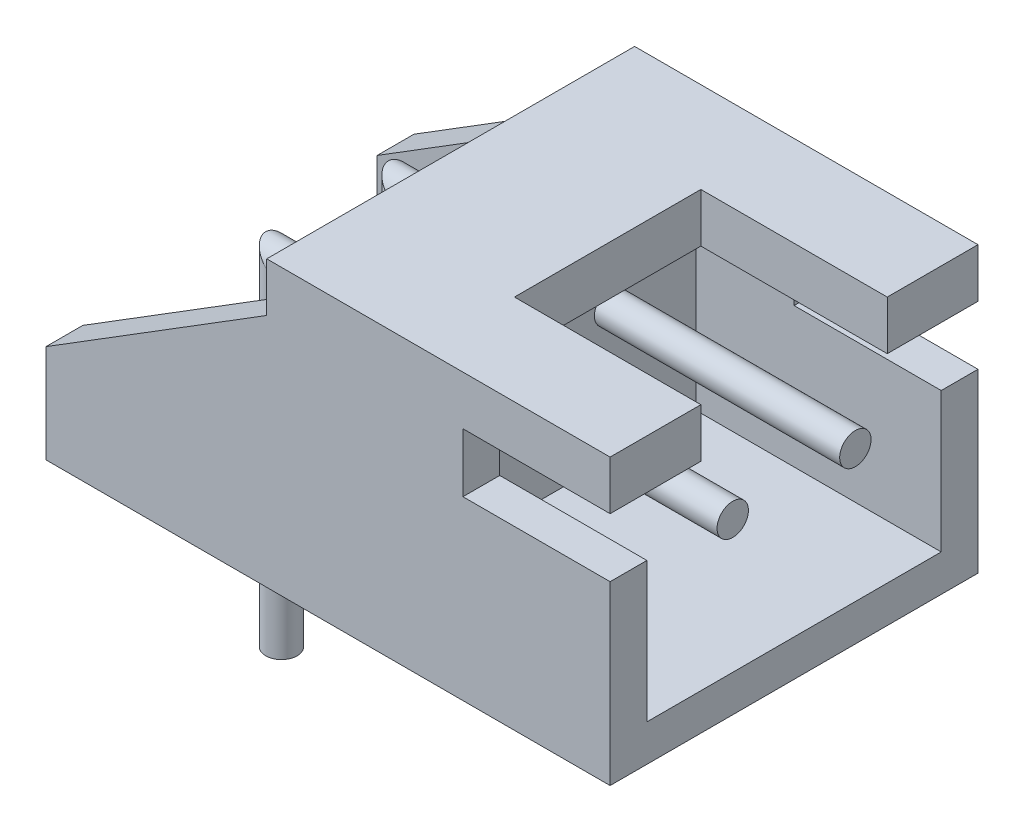
ISO-10303-21;
HEADER;
FILE_DESCRIPTION(('STEP AP214'),'2;1');
FILE_NAME('part.step','',(''),(''),'','','');
FILE_SCHEMA(('AUTOMOTIVE_DESIGN { 1 0 10303 214 1 1 1 1 }'));
ENDSEC;
DATA;
#1=APPLICATION_CONTEXT('core data for automotive mechanical design processes');
#2=APPLICATION_PROTOCOL_DEFINITION('international standard','automotive_design',2000,#1);
#3=PRODUCT_CONTEXT('',#1,'mechanical');
#4=PRODUCT('Part','Part','',(#3));
#5=PRODUCT_RELATED_PRODUCT_CATEGORY('part','',(#4));
#6=PRODUCT_DEFINITION_FORMATION('','',#4);
#7=PRODUCT_DEFINITION_CONTEXT('part definition',#1,'design');
#8=PRODUCT_DEFINITION('design','',#6,#7);
#9=PRODUCT_DEFINITION_SHAPE('','',#8);
#10=(LENGTH_UNIT() NAMED_UNIT(*) SI_UNIT(.MILLI.,.METRE.));
#11=(NAMED_UNIT(*) PLANE_ANGLE_UNIT() SI_UNIT($,.RADIAN.));
#12=(NAMED_UNIT(*) SI_UNIT($,.STERADIAN.) SOLID_ANGLE_UNIT());
#13=UNCERTAINTY_MEASURE_WITH_UNIT(LENGTH_MEASURE(1.E-05),#10,'distance_accuracy_value','');
#14=(GEOMETRIC_REPRESENTATION_CONTEXT(3) GLOBAL_UNCERTAINTY_ASSIGNED_CONTEXT((#13)) GLOBAL_UNIT_ASSIGNED_CONTEXT((#10,
#11,#12)) REPRESENTATION_CONTEXT('',''));
#15=CARTESIAN_POINT('',(0.,0.,0.));
#16=DIRECTION('',(0.,0.,1.));
#17=DIRECTION('',(1.,0.,0.));
#18=AXIS2_PLACEMENT_3D('',#15,#16,#17);
#19=CARTESIAN_POINT('',(11.5,3.45,5.));
#20=DIRECTION('',(-1.,0.,0.));
#21=DIRECTION('',(0.,0.,1.));
#22=AXIS2_PLACEMENT_3D('',#19,#20,#21);
#23=PLANE('',#22);
#24=CARTESIAN_POINT('',(11.5,3.45,5.));
#25=DIRECTION('',(-1.,0.,0.));
#26=DIRECTION('',(0.,0.,1.));
#27=AXIS2_PLACEMENT_3D('',#24,#25,#26);
#28=CIRCLE('',#27,0.32);
#29=CARTESIAN_POINT('',(11.5,3.45,5.32));
#30=VERTEX_POINT('',#29);
#31=EDGE_CURVE('E20',#30,#30,#28,.T.);
#32=ORIENTED_EDGE('',*,*,#31,.F.);
#33=EDGE_LOOP('',(#32));
#34=FACE_BOUND('',#33,.T.);
#35=ADVANCED_FACE('F17',(#34),#23,.F.);
#36=CARTESIAN_POINT('',(11.5,3.45,2.5));
#37=DIRECTION('',(1.,0.,0.));
#38=DIRECTION('',(0.,0.,-1.));
#39=AXIS2_PLACEMENT_3D('',#36,#37,#38);
#40=PLANE('',#39);
#41=CARTESIAN_POINT('',(11.5,3.45,2.5));
#42=DIRECTION('',(1.,0.,0.));
#43=DIRECTION('',(0.,0.,-1.));
#44=AXIS2_PLACEMENT_3D('',#41,#42,#43);
#45=CIRCLE('',#44,0.32);
#46=CARTESIAN_POINT('',(11.5,3.45,2.18));
#47=VERTEX_POINT('',#46);
#48=EDGE_CURVE('E258',#47,#47,#45,.F.);
#49=ORIENTED_EDGE('',*,*,#48,.F.);
#50=EDGE_LOOP('',(#49));
#51=FACE_BOUND('',#50,.T.);
#52=ADVANCED_FACE('F269',(#51),#40,.T.);
#53=CARTESIAN_POINT('',(2.3,-3.4,2.5));
#54=DIRECTION('',(0.,1.,0.));
#55=DIRECTION('',(0.,0.,1.));
#56=AXIS2_PLACEMENT_3D('',#53,#54,#55);
#57=PLANE('',#56);
#58=CARTESIAN_POINT('',(2.3,-3.4,2.5));
#59=DIRECTION('',(0.,1.,0.));
#60=DIRECTION('',(0.,0.,1.));
#61=AXIS2_PLACEMENT_3D('',#58,#59,#60);
#62=CIRCLE('',#61,0.32);
#63=CARTESIAN_POINT('',(2.3,-3.4,2.82));
#64=VERTEX_POINT('',#63);
#65=EDGE_CURVE('E256',#64,#64,#62,.T.);
#66=ORIENTED_EDGE('',*,*,#65,.F.);
#67=EDGE_LOOP('',(#66));
#68=FACE_BOUND('',#67,.T.);
#69=ADVANCED_FACE('F274',(#68),#57,.F.);
#70=CARTESIAN_POINT('',(11.5,3.45,5.));
#71=DIRECTION('',(-1.,0.,0.));
#72=DIRECTION('',(0.,0.,1.));
#73=AXIS2_PLACEMENT_3D('',#70,#71,#72);
#74=CYLINDRICAL_SURFACE('',#73,0.32);
#75=ORIENTED_EDGE('',*,*,#31,.T.);
#76=EDGE_LOOP('',(#75));
#77=FACE_BOUND('',#76,.T.);
#78=CARTESIAN_POINT('',(6.5,3.45,5.));
#79=DIRECTION('',(-1.,0.,0.));
#80=DIRECTION('',(0.,0.,1.));
#81=AXIS2_PLACEMENT_3D('',#78,#79,#80);
#82=CIRCLE('',#81,0.32);
#83=CARTESIAN_POINT('',(6.5,3.45,5.32));
#84=VERTEX_POINT('',#83);
#85=EDGE_CURVE('E253',#84,#84,#82,.T.);
#86=ORIENTED_EDGE('',*,*,#85,.F.);
#87=EDGE_LOOP('',(#86));
#88=FACE_BOUND('',#87,.T.);
#89=ADVANCED_FACE('F265',(#77,#88),#74,.T.);
#90=CARTESIAN_POINT('',(11.5,3.45,2.5));
#91=DIRECTION('',(1.,0.,0.));
#92=DIRECTION('',(0.,0.,-1.));
#93=AXIS2_PLACEMENT_3D('',#90,#91,#92);
#94=CYLINDRICAL_SURFACE('',#93,0.32);
#95=ORIENTED_EDGE('',*,*,#48,.T.);
#96=EDGE_LOOP('',(#95));
#97=FACE_BOUND('',#96,.T.);
#98=CARTESIAN_POINT('',(6.5,3.45,2.5));
#99=DIRECTION('',(1.,0.,0.));
#100=DIRECTION('',(0.,0.,-1.));
#101=AXIS2_PLACEMENT_3D('',#98,#99,#100);
#102=CIRCLE('',#101,0.32);
#103=CARTESIAN_POINT('',(6.5,3.45,2.18));
#104=VERTEX_POINT('',#103);
#105=EDGE_CURVE('E234',#104,#104,#102,.F.);
#106=ORIENTED_EDGE('',*,*,#105,.F.);
#107=EDGE_LOOP('',(#106));
#108=FACE_BOUND('',#107,.T.);
#109=ADVANCED_FACE('F396',(#97,#108),#94,.T.);
#110=CARTESIAN_POINT('',(2.3,-3.4,5.));
#111=DIRECTION('',(0.,-1.,0.));
#112=DIRECTION('',(0.,0.,-1.));
#113=AXIS2_PLACEMENT_3D('',#110,#111,#112);
#114=PLANE('',#113);
#115=CARTESIAN_POINT('',(2.3,-3.4,5.));
#116=DIRECTION('',(0.,-1.,0.));
#117=DIRECTION('',(0.,0.,-1.));
#118=AXIS2_PLACEMENT_3D('',#115,#116,#117);
#119=CIRCLE('',#118,0.32);
#120=CARTESIAN_POINT('',(2.3,-3.4,4.68));
#121=VERTEX_POINT('',#120);
#122=EDGE_CURVE('E223',#121,#121,#119,.F.);
#123=ORIENTED_EDGE('',*,*,#122,.F.);
#124=EDGE_LOOP('',(#123));
#125=FACE_BOUND('',#124,.T.);
#126=ADVANCED_FACE('F392',(#125),#114,.T.);
#127=CARTESIAN_POINT('',(2.3,3.45,2.5));
#128=DIRECTION('',(0.,1.,0.));
#129=DIRECTION('',(0.,0.,1.));
#130=AXIS2_PLACEMENT_3D('',#127,#128,#129);
#131=CYLINDRICAL_SURFACE('',#130,0.32);
#132=ORIENTED_EDGE('',*,*,#65,.T.);
#133=EDGE_LOOP('',(#132));
#134=FACE_BOUND('',#133,.T.);
#135=CARTESIAN_POINT('',(2.3,3.45,2.5));
#136=DIRECTION('',(0.707106781186547,0.707106781186547,0.));
#137=DIRECTION('',(-0.707106781186547,0.707106781186547,0.));
#138=AXIS2_PLACEMENT_3D('',#135,#136,#137);
#139=ELLIPSE('',#138,0.45254833995939,0.32);
#140=CARTESIAN_POINT('',(1.98,3.77,2.5));
#141=VERTEX_POINT('',#140);
#142=EDGE_CURVE('E220',#141,#141,#139,.T.);
#143=ORIENTED_EDGE('',*,*,#142,.F.);
#144=EDGE_LOOP('',(#143));
#145=FACE_BOUND('',#144,.T.);
#146=ADVANCED_FACE('F388',(#134,#145),#131,.T.);
#147=CARTESIAN_POINT('',(6.5,0.,0.));
#148=DIRECTION('',(1.,0.,0.));
#149=DIRECTION('',(0.,0.,-1.));
#150=AXIS2_PLACEMENT_3D('',#147,#148,#149);
#151=PLANE('',#150);
#152=ORIENTED_EDGE('',*,*,#105,.T.);
#153=EDGE_LOOP('',(#152));
#154=FACE_BOUND('',#153,.T.);
#155=ORIENTED_EDGE('',*,*,#85,.T.);
#156=EDGE_LOOP('',(#155));
#157=FACE_BOUND('',#156,.T.);
#158=DIRECTION('',(0.,0.,-1.));
#159=VECTOR('',#158,1.);
#160=CARTESIAN_POINT('',(6.5,4.8,0.));
#161=LINE('',#160,#159);
#162=CARTESIAN_POINT('',(6.5,4.8,6.75));
#163=VERTEX_POINT('',#162);
#164=CARTESIAN_POINT('',(6.5,4.8,0.75));
#165=VERTEX_POINT('',#164);
#166=EDGE_CURVE('E522',#163,#165,#161,.T.);
#167=ORIENTED_EDGE('',*,*,#166,.F.);
#168=DIRECTION('',(0.,1.,0.));
#169=VECTOR('',#168,1.);
#170=CARTESIAN_POINT('',(6.5,4.8,6.75));
#171=LINE('',#170,#169);
#172=CARTESIAN_POINT('',(6.5,0.75,6.75));
#173=VERTEX_POINT('',#172);
#174=EDGE_CURVE('E543',#163,#173,#171,.F.);
#175=ORIENTED_EDGE('',*,*,#174,.T.);
#176=DIRECTION('',(0.,0.,-1.));
#177=VECTOR('',#176,1.);
#178=CARTESIAN_POINT('',(6.5,0.75,6.75));
#179=LINE('',#178,#177);
#180=CARTESIAN_POINT('',(6.5,0.75,0.75));
#181=VERTEX_POINT('',#180);
#182=EDGE_CURVE('E175',#173,#181,#179,.T.);
#183=ORIENTED_EDGE('',*,*,#182,.T.);
#184=DIRECTION('',(0.,1.,0.));
#185=VECTOR('',#184,1.);
#186=CARTESIAN_POINT('',(6.5,0.75,0.75));
#187=LINE('',#186,#185);
#188=EDGE_CURVE('E191',#181,#165,#187,.T.);
#189=ORIENTED_EDGE('',*,*,#188,.T.);
#190=EDGE_LOOP('',(#167,#175,#183,#189));
#191=FACE_BOUND('',#190,.T.);
#192=ADVANCED_FACE('F384',(#154,#157,#191),#151,.T.);
#193=CARTESIAN_POINT('',(7.7,5.8,1.85));
#194=DIRECTION('',(-1.,0.,0.));
#195=DIRECTION('',(0.,0.,1.));
#196=AXIS2_PLACEMENT_3D('',#193,#194,#195);
#197=PLANE('',#196);
#198=DIRECTION('',(0.,0.,-1.));
#199=VECTOR('',#198,1.);
#200=CARTESIAN_POINT('',(7.7,4.8,0.));
#201=LINE('',#200,#199);
#202=CARTESIAN_POINT('',(7.7,4.8,1.85));
#203=VERTEX_POINT('',#202);
#204=CARTESIAN_POINT('',(7.7,4.8,5.65));
#205=VERTEX_POINT('',#204);
#206=EDGE_CURVE('E510',#203,#205,#201,.F.);
#207=ORIENTED_EDGE('',*,*,#206,.F.);
#208=DIRECTION('',(0.,1.,0.));
#209=VECTOR('',#208,1.);
#210=CARTESIAN_POINT('',(7.7,5.8,1.85));
#211=LINE('',#210,#209);
#212=CARTESIAN_POINT('',(7.7,5.8,1.85));
#213=VERTEX_POINT('',#212);
#214=EDGE_CURVE('E232',#203,#213,#211,.T.);
#215=ORIENTED_EDGE('',*,*,#214,.T.);
#216=DIRECTION('',(0.,0.,1.));
#217=VECTOR('',#216,1.);
#218=CARTESIAN_POINT('',(7.7,5.8,0.));
#219=LINE('',#218,#217);
#220=CARTESIAN_POINT('',(7.7,5.8,5.65));
#221=VERTEX_POINT('',#220);
#222=EDGE_CURVE('E499',#221,#213,#219,.F.);
#223=ORIENTED_EDGE('',*,*,#222,.F.);
#224=DIRECTION('',(0.,1.,0.));
#225=VECTOR('',#224,1.);
#226=CARTESIAN_POINT('',(7.7,5.8,5.65));
#227=LINE('',#226,#225);
#228=EDGE_CURVE('E221',#221,#205,#227,.F.);
#229=ORIENTED_EDGE('',*,*,#228,.T.);
#230=EDGE_LOOP('',(#207,#215,#223,#229));
#231=FACE_BOUND('',#230,.T.);
#232=ADVANCED_FACE('F380',(#231),#197,.F.);
#233=CARTESIAN_POINT('',(11.61432917264,5.8,1.85));
#234=DIRECTION('',(0.,0.,-1.));
#235=DIRECTION('',(-1.,0.,0.));
#236=AXIS2_PLACEMENT_3D('',#233,#234,#235);
#237=PLANE('',#236);
#238=ORIENTED_EDGE('',*,*,#214,.F.);
#239=DIRECTION('',(1.,0.,0.));
#240=VECTOR('',#239,1.);
#241=CARTESIAN_POINT('',(8.5,4.8,1.85));
#242=LINE('',#241,#240);
#243=CARTESIAN_POINT('',(11.5,4.8,1.85));
#244=VERTEX_POINT('',#243);
#245=EDGE_CURVE('E513',#244,#203,#242,.F.);
#246=ORIENTED_EDGE('',*,*,#245,.F.);
#247=DIRECTION('',(0.,1.,0.));
#248=VECTOR('',#247,1.);
#249=CARTESIAN_POINT('',(11.5,4.8,1.85));
#250=LINE('',#249,#248);
#251=CARTESIAN_POINT('',(11.5,5.8,1.85));
#252=VERTEX_POINT('',#251);
#253=EDGE_CURVE('E228',#252,#244,#250,.F.);
#254=ORIENTED_EDGE('',*,*,#253,.F.);
#255=DIRECTION('',(1.,0.,0.));
#256=VECTOR('',#255,1.);
#257=CARTESIAN_POINT('',(11.5,5.8,1.85));
#258=LINE('',#257,#256);
#259=EDGE_CURVE('E496',#213,#252,#258,.T.);
#260=ORIENTED_EDGE('',*,*,#259,.F.);
#261=EDGE_LOOP('',(#238,#246,#254,#260));
#262=FACE_BOUND('',#261,.T.);
#263=ADVANCED_FACE('F376',(#262),#237,.F.);
#264=CARTESIAN_POINT('',(11.5,4.8,0.));
#265=DIRECTION('',(1.,0.,0.));
#266=DIRECTION('',(0.,0.,-1.));
#267=AXIS2_PLACEMENT_3D('',#264,#265,#266);
#268=PLANE('',#267);
#269=DIRECTION('',(0.,0.,1.));
#270=VECTOR('',#269,1.);
#271=CARTESIAN_POINT('',(11.5,5.8,0.));
#272=LINE('',#271,#270);
#273=CARTESIAN_POINT('',(11.5,5.8,0.));
#274=VERTEX_POINT('',#273);
#275=EDGE_CURVE('E493',#252,#274,#272,.F.);
#276=ORIENTED_EDGE('',*,*,#275,.F.);
#277=ORIENTED_EDGE('',*,*,#253,.T.);
#278=DIRECTION('',(0.,0.,-1.));
#279=VECTOR('',#278,1.);
#280=CARTESIAN_POINT('',(11.5,4.8,0.));
#281=LINE('',#280,#279);
#282=CARTESIAN_POINT('',(11.5,4.8,0.));
#283=VERTEX_POINT('',#282);
#284=EDGE_CURVE('E516',#283,#244,#281,.F.);
#285=ORIENTED_EDGE('',*,*,#284,.F.);
#286=DIRECTION('',(0.,1.,0.));
#287=VECTOR('',#286,1.);
#288=CARTESIAN_POINT('',(11.5,4.8,0.));
#289=LINE('',#288,#287);
#290=EDGE_CURVE('E230',#283,#274,#289,.T.);
#291=ORIENTED_EDGE('',*,*,#290,.T.);
#292=EDGE_LOOP('',(#276,#277,#285,#291));
#293=FACE_BOUND('',#292,.T.);
#294=ADVANCED_FACE('F372',(#293),#268,.T.);
#295=CARTESIAN_POINT('',(11.5,4.8,0.));
#296=DIRECTION('',(1.,0.,0.));
#297=DIRECTION('',(0.,0.,-1.));
#298=AXIS2_PLACEMENT_3D('',#295,#296,#297);
#299=PLANE('',#298);
#300=DIRECTION('',(0.,0.,-1.));
#301=VECTOR('',#300,1.);
#302=CARTESIAN_POINT('',(11.5,4.8,0.));
#303=LINE('',#302,#301);
#304=CARTESIAN_POINT('',(11.5,4.8,5.65));
#305=VERTEX_POINT('',#304);
#306=CARTESIAN_POINT('',(11.5,4.8,7.5));
#307=VERTEX_POINT('',#306);
#308=EDGE_CURVE('E531',#305,#307,#303,.F.);
#309=ORIENTED_EDGE('',*,*,#308,.F.);
#310=DIRECTION('',(0.,1.,0.));
#311=VECTOR('',#310,1.);
#312=CARTESIAN_POINT('',(11.5,5.8,5.65));
#313=LINE('',#312,#311);
#314=CARTESIAN_POINT('',(11.5,5.8,5.65));
#315=VERTEX_POINT('',#314);
#316=EDGE_CURVE('E224',#305,#315,#313,.T.);
#317=ORIENTED_EDGE('',*,*,#316,.T.);
#318=DIRECTION('',(0.,0.,1.));
#319=VECTOR('',#318,1.);
#320=CARTESIAN_POINT('',(11.5,5.8,0.));
#321=LINE('',#320,#319);
#322=CARTESIAN_POINT('',(11.5,5.8,7.5));
#323=VERTEX_POINT('',#322);
#324=EDGE_CURVE('E490',#323,#315,#321,.F.);
#325=ORIENTED_EDGE('',*,*,#324,.F.);
#326=DIRECTION('',(0.,1.,0.));
#327=VECTOR('',#326,1.);
#328=CARTESIAN_POINT('',(11.5,4.8,7.5));
#329=LINE('',#328,#327);
#330=EDGE_CURVE('E226',#323,#307,#329,.F.);
#331=ORIENTED_EDGE('',*,*,#330,.T.);
#332=EDGE_LOOP('',(#309,#317,#325,#331));
#333=FACE_BOUND('',#332,.T.);
#334=ADVANCED_FACE('F368',(#333),#299,.T.);
#335=CARTESIAN_POINT('',(7.7,5.8,5.65));
#336=DIRECTION('',(0.,0.,1.));
#337=DIRECTION('',(1.,0.,0.));
#338=AXIS2_PLACEMENT_3D('',#335,#336,#337);
#339=PLANE('',#338);
#340=ORIENTED_EDGE('',*,*,#228,.F.);
#341=DIRECTION('',(1.,0.,0.));
#342=VECTOR('',#341,1.);
#343=CARTESIAN_POINT('',(11.5,5.8,5.65));
#344=LINE('',#343,#342);
#345=EDGE_CURVE('E246',#315,#221,#344,.F.);
#346=ORIENTED_EDGE('',*,*,#345,.F.);
#347=ORIENTED_EDGE('',*,*,#316,.F.);
#348=DIRECTION('',(1.,0.,0.));
#349=VECTOR('',#348,1.);
#350=CARTESIAN_POINT('',(8.5,4.8,5.65));
#351=LINE('',#350,#349);
#352=EDGE_CURVE('E507',#205,#305,#351,.T.);
#353=ORIENTED_EDGE('',*,*,#352,.F.);
#354=EDGE_LOOP('',(#340,#346,#347,#353));
#355=FACE_BOUND('',#354,.T.);
#356=ADVANCED_FACE('F364',(#355),#339,.F.);
#357=CARTESIAN_POINT('',(2.3,3.45,5.));
#358=DIRECTION('',(0.,-1.,0.));
#359=DIRECTION('',(0.,0.,-1.));
#360=AXIS2_PLACEMENT_3D('',#357,#358,#359);
#361=CYLINDRICAL_SURFACE('',#360,0.32);
#362=ORIENTED_EDGE('',*,*,#122,.T.);
#363=EDGE_LOOP('',(#362));
#364=FACE_BOUND('',#363,.T.);
#365=CARTESIAN_POINT('',(2.3,3.45,5.));
#366=DIRECTION('',(-0.707106781186547,-0.707106781186547,0.));
#367=DIRECTION('',(0.707106781186547,-0.707106781186547,0.));
#368=AXIS2_PLACEMENT_3D('',#365,#366,#367);
#369=ELLIPSE('',#368,0.45254833995939,0.32);
#370=CARTESIAN_POINT('',(2.62,3.13,5.));
#371=VERTEX_POINT('',#370);
#372=EDGE_CURVE('E242',#371,#371,#369,.F.);
#373=ORIENTED_EDGE('',*,*,#372,.F.);
#374=EDGE_LOOP('',(#373));
#375=FACE_BOUND('',#374,.T.);
#376=ADVANCED_FACE('F360',(#364,#375),#361,.T.);
#377=CARTESIAN_POINT('',(4.5,4.8,0.));
#378=DIRECTION('',(-0.52830188679248,0.849056603773568,0.));
#379=DIRECTION('',(-0.849056603773568,-0.52830188679248,0.));
#380=AXIS2_PLACEMENT_3D('',#377,#378,#379);
#381=PLANE('',#380);
#382=DIRECTION('',(0.,0.,1.));
#383=VECTOR('',#382,1.);
#384=CARTESIAN_POINT('',(0.,2.,0.));
#385=LINE('',#384,#383);
#386=CARTESIAN_POINT('',(0.,1.99999999999996,0.75));
#387=VERTEX_POINT('',#386);
#388=CARTESIAN_POINT('',(0.,1.99999999999993,0.));
#389=VERTEX_POINT('',#388);
#390=EDGE_CURVE('E215',#387,#389,#385,.F.);
#391=ORIENTED_EDGE('',*,*,#390,.F.);
#392=DIRECTION('',(0.849056603773585,0.528301886792453,0.));
#393=VECTOR('',#392,1.);
#394=CARTESIAN_POINT('',(0.,2.,0.75));
#395=LINE('',#394,#393);
#396=CARTESIAN_POINT('',(4.5,4.8,0.75));
#397=VERTEX_POINT('',#396);
#398=EDGE_CURVE('E483',#387,#397,#395,.T.);
#399=ORIENTED_EDGE('',*,*,#398,.T.);
#400=DIRECTION('',(0.,0.,1.));
#401=VECTOR('',#400,1.);
#402=CARTESIAN_POINT('',(4.5,4.8,0.));
#403=LINE('',#402,#401);
#404=CARTESIAN_POINT('',(4.5,4.8,0.));
#405=VERTEX_POINT('',#404);
#406=EDGE_CURVE('E218',#397,#405,#403,.F.);
#407=ORIENTED_EDGE('',*,*,#406,.T.);
#408=DIRECTION('',(-0.849056603773585,-0.528301886792453,0.));
#409=VECTOR('',#408,1.);
#410=CARTESIAN_POINT('',(4.5,4.8,0.));
#411=LINE('',#410,#409);
#412=EDGE_CURVE('E481',#405,#389,#411,.T.);
#413=ORIENTED_EDGE('',*,*,#412,.T.);
#414=EDGE_LOOP('',(#391,#399,#407,#413));
#415=FACE_BOUND('',#414,.T.);
#416=ADVANCED_FACE('F356',(#415),#381,.T.);
#417=CARTESIAN_POINT('',(0.,2.,0.));
#418=DIRECTION('',(-1.,0.,0.));
#419=DIRECTION('',(0.,0.,1.));
#420=AXIS2_PLACEMENT_3D('',#417,#418,#419);
#421=PLANE('',#420);
#422=DIRECTION('',(0.,0.,1.));
#423=VECTOR('',#422,1.);
#424=CARTESIAN_POINT('',(0.,0.,0.));
#425=LINE('',#424,#423);
#426=CARTESIAN_POINT('',(0.,0.,0.));
#427=VERTEX_POINT('',#426);
#428=CARTESIAN_POINT('',(0.,0.,0.75));
#429=VERTEX_POINT('',#428);
#430=EDGE_CURVE('E213',#427,#429,#425,.T.);
#431=ORIENTED_EDGE('',*,*,#430,.T.);
#432=DIRECTION('',(0.,1.,0.));
#433=VECTOR('',#432,1.);
#434=CARTESIAN_POINT('',(0.,5.8,0.75));
#435=LINE('',#434,#433);
#436=EDGE_CURVE('E245',#429,#387,#435,.T.);
#437=ORIENTED_EDGE('',*,*,#436,.T.);
#438=ORIENTED_EDGE('',*,*,#390,.T.);
#439=DIRECTION('',(0.,1.,0.));
#440=VECTOR('',#439,1.);
#441=CARTESIAN_POINT('',(0.,0.,0.));
#442=LINE('',#441,#440);
#443=EDGE_CURVE('E478',#389,#427,#442,.F.);
#444=ORIENTED_EDGE('',*,*,#443,.T.);
#445=EDGE_LOOP('',(#431,#437,#438,#444));
#446=FACE_BOUND('',#445,.T.);
#447=ADVANCED_FACE('F353',(#446),#421,.T.);
#448=CARTESIAN_POINT('',(11.5,3.6,0.));
#449=DIRECTION('',(0.,1.,0.));
#450=DIRECTION('',(0.,0.,1.));
#451=AXIS2_PLACEMENT_3D('',#448,#449,#450);
#452=PLANE('',#451);
#453=DIRECTION('',(0.,0.,-1.));
#454=VECTOR('',#453,1.);
#455=CARTESIAN_POINT('',(8.5,3.6,0.));
#456=LINE('',#455,#454);
#457=CARTESIAN_POINT('',(8.5,3.6,0.75));
#458=VERTEX_POINT('',#457);
#459=CARTESIAN_POINT('',(8.5,3.6,0.));
#460=VERTEX_POINT('',#459);
#461=EDGE_CURVE('E181',#458,#460,#456,.T.);
#462=ORIENTED_EDGE('',*,*,#461,.F.);
#463=DIRECTION('',(-1.,0.,0.));
#464=VECTOR('',#463,1.);
#465=CARTESIAN_POINT('',(11.5,3.6,0.75));
#466=LINE('',#465,#464);
#467=CARTESIAN_POINT('',(11.5,3.6,0.75));
#468=VERTEX_POINT('',#467);
#469=EDGE_CURVE('E185',#458,#468,#466,.F.);
#470=ORIENTED_EDGE('',*,*,#469,.T.);
#471=DIRECTION('',(0.,0.,1.));
#472=VECTOR('',#471,1.);
#473=CARTESIAN_POINT('',(11.5,3.6,0.));
#474=LINE('',#473,#472);
#475=CARTESIAN_POINT('',(11.5,3.6,0.));
#476=VERTEX_POINT('',#475);
#477=EDGE_CURVE('E192',#468,#476,#474,.F.);
#478=ORIENTED_EDGE('',*,*,#477,.T.);
#479=DIRECTION('',(1.,0.,0.));
#480=VECTOR('',#479,1.);
#481=CARTESIAN_POINT('',(0.,3.6,0.));
#482=LINE('',#481,#480);
#483=EDGE_CURVE('E188',#476,#460,#482,.F.);
#484=ORIENTED_EDGE('',*,*,#483,.T.);
#485=EDGE_LOOP('',(#462,#470,#478,#484));
#486=FACE_BOUND('',#485,.T.);
#487=ADVANCED_FACE('F183',(#486),#452,.T.);
#488=CARTESIAN_POINT('',(8.5,3.6,0.));
#489=DIRECTION('',(1.,0.,0.));
#490=DIRECTION('',(0.,0.,-1.));
#491=AXIS2_PLACEMENT_3D('',#488,#489,#490);
#492=PLANE('',#491);
#493=DIRECTION('',(0.,0.,-1.));
#494=VECTOR('',#493,1.);
#495=CARTESIAN_POINT('',(8.5,4.8,0.));
#496=LINE('',#495,#494);
#497=CARTESIAN_POINT('',(8.5,4.8,0.75));
#498=VERTEX_POINT('',#497);
#499=CARTESIAN_POINT('',(8.5,4.8,0.));
#500=VERTEX_POINT('',#499);
#501=EDGE_CURVE('E198',#498,#500,#496,.T.);
#502=ORIENTED_EDGE('',*,*,#501,.F.);
#503=DIRECTION('',(0.,1.,0.));
#504=VECTOR('',#503,1.);
#505=CARTESIAN_POINT('',(8.5,0.75,0.75));
#506=LINE('',#505,#504);
#507=EDGE_CURVE('E195',#498,#458,#506,.F.);
#508=ORIENTED_EDGE('',*,*,#507,.T.);
#509=ORIENTED_EDGE('',*,*,#461,.T.);
#510=DIRECTION('',(0.,1.,0.));
#511=VECTOR('',#510,1.);
#512=CARTESIAN_POINT('',(8.5,0.,0.));
#513=LINE('',#512,#511);
#514=EDGE_CURVE('E475',#460,#500,#513,.T.);
#515=ORIENTED_EDGE('',*,*,#514,.T.);
#516=EDGE_LOOP('',(#502,#508,#509,#515));
#517=FACE_BOUND('',#516,.T.);
#518=ADVANCED_FACE('F196',(#517),#492,.T.);
#519=CARTESIAN_POINT('',(11.5,0.75,0.75));
#520=DIRECTION('',(0.,0.,-1.));
#521=DIRECTION('',(-1.,0.,0.));
#522=AXIS2_PLACEMENT_3D('',#519,#520,#521);
#523=PLANE('',#522);
#524=ORIENTED_EDGE('',*,*,#507,.F.);
#525=DIRECTION('',(1.,0.,0.));
#526=VECTOR('',#525,1.);
#527=CARTESIAN_POINT('',(8.5,4.8,0.75));
#528=LINE('',#527,#526);
#529=EDGE_CURVE('E520',#165,#498,#528,.T.);
#530=ORIENTED_EDGE('',*,*,#529,.F.);
#531=ORIENTED_EDGE('',*,*,#188,.F.);
#532=DIRECTION('',(1.,0.,0.));
#533=VECTOR('',#532,1.);
#534=CARTESIAN_POINT('',(11.5,0.75,0.75));
#535=LINE('',#534,#533);
#536=CARTESIAN_POINT('',(11.5,0.75,0.75));
#537=VERTEX_POINT('',#536);
#538=EDGE_CURVE('E207',#181,#537,#535,.T.);
#539=ORIENTED_EDGE('',*,*,#538,.T.);
#540=DIRECTION('',(0.,1.,0.));
#541=VECTOR('',#540,1.);
#542=CARTESIAN_POINT('',(11.5,0.,0.75));
#543=LINE('',#542,#541);
#544=EDGE_CURVE('E205',#468,#537,#543,.F.);
#545=ORIENTED_EDGE('',*,*,#544,.F.);
#546=ORIENTED_EDGE('',*,*,#469,.F.);
#547=EDGE_LOOP('',(#524,#530,#531,#539,#545,#546));
#548=FACE_BOUND('',#547,.T.);
#549=ADVANCED_FACE('F203',(#548),#523,.F.);
#550=CARTESIAN_POINT('',(11.5,0.75,6.75));
#551=DIRECTION('',(0.,-1.,0.));
#552=DIRECTION('',(0.,0.,-1.));
#553=AXIS2_PLACEMENT_3D('',#550,#551,#552);
#554=PLANE('',#553);
#555=ORIENTED_EDGE('',*,*,#182,.F.);
#556=DIRECTION('',(1.,0.,0.));
#557=VECTOR('',#556,1.);
#558=CARTESIAN_POINT('',(11.5,0.75,6.75));
#559=LINE('',#558,#557);
#560=CARTESIAN_POINT('',(11.5,0.75,6.75));
#561=VERTEX_POINT('',#560);
#562=EDGE_CURVE('E541',#173,#561,#559,.T.);
#563=ORIENTED_EDGE('',*,*,#562,.T.);
#564=DIRECTION('',(0.,0.,-1.));
#565=VECTOR('',#564,1.);
#566=CARTESIAN_POINT('',(11.5,0.75,0.));
#567=LINE('',#566,#565);
#568=EDGE_CURVE('E461',#537,#561,#567,.F.);
#569=ORIENTED_EDGE('',*,*,#568,.F.);
#570=ORIENTED_EDGE('',*,*,#538,.F.);
#571=EDGE_LOOP('',(#555,#563,#569,#570));
#572=FACE_BOUND('',#571,.T.);
#573=ADVANCED_FACE('F342',(#572),#554,.F.);
#574=CARTESIAN_POINT('',(11.5,4.8,6.75));
#575=DIRECTION('',(0.,0.,1.));
#576=DIRECTION('',(1.,0.,0.));
#577=AXIS2_PLACEMENT_3D('',#574,#575,#576);
#578=PLANE('',#577);
#579=ORIENTED_EDGE('',*,*,#174,.F.);
#580=DIRECTION('',(1.,0.,0.));
#581=VECTOR('',#580,1.);
#582=CARTESIAN_POINT('',(8.5,4.8,6.75));
#583=LINE('',#582,#581);
#584=CARTESIAN_POINT('',(8.5,4.8,6.75));
#585=VERTEX_POINT('',#584);
#586=EDGE_CURVE('E525',#585,#163,#583,.F.);
#587=ORIENTED_EDGE('',*,*,#586,.F.);
#588=DIRECTION('',(0.,1.,0.));
#589=VECTOR('',#588,1.);
#590=CARTESIAN_POINT('',(8.5,3.6,6.75));
#591=LINE('',#590,#589);
#592=CARTESIAN_POINT('',(8.5,3.6,6.75));
#593=VERTEX_POINT('',#592);
#594=EDGE_CURVE('E534',#593,#585,#591,.T.);
#595=ORIENTED_EDGE('',*,*,#594,.F.);
#596=DIRECTION('',(1.,0.,0.));
#597=VECTOR('',#596,1.);
#598=CARTESIAN_POINT('',(11.5,3.6,6.75));
#599=LINE('',#598,#597);
#600=CARTESIAN_POINT('',(11.5,3.6,6.75));
#601=VERTEX_POINT('',#600);
#602=EDGE_CURVE('E539',#601,#593,#599,.F.);
#603=ORIENTED_EDGE('',*,*,#602,.F.);
#604=DIRECTION('',(0.,1.,0.));
#605=VECTOR('',#604,1.);
#606=CARTESIAN_POINT('',(11.5,0.,6.75));
#607=LINE('',#606,#605);
#608=EDGE_CURVE('E458',#561,#601,#607,.T.);
#609=ORIENTED_EDGE('',*,*,#608,.F.);
#610=ORIENTED_EDGE('',*,*,#562,.F.);
#611=EDGE_LOOP('',(#579,#587,#595,#603,#609,#610));
#612=FACE_BOUND('',#611,.T.);
#613=ADVANCED_FACE('F338',(#612),#578,.F.);
#614=CARTESIAN_POINT('',(11.5,3.6,0.));
#615=DIRECTION('',(0.,1.,0.));
#616=DIRECTION('',(0.,0.,1.));
#617=AXIS2_PLACEMENT_3D('',#614,#615,#616);
#618=PLANE('',#617);
#619=DIRECTION('',(0.,0.,-1.));
#620=VECTOR('',#619,1.);
#621=CARTESIAN_POINT('',(11.5,3.6,0.));
#622=LINE('',#621,#620);
#623=CARTESIAN_POINT('',(11.5,3.6,7.5));
#624=VERTEX_POINT('',#623);
#625=EDGE_CURVE('E468',#601,#624,#622,.F.);
#626=ORIENTED_EDGE('',*,*,#625,.F.);
#627=ORIENTED_EDGE('',*,*,#602,.T.);
#628=DIRECTION('',(0.,0.,-1.));
#629=VECTOR('',#628,1.);
#630=CARTESIAN_POINT('',(8.5,3.6,0.));
#631=LINE('',#630,#629);
#632=CARTESIAN_POINT('',(8.5,3.6,7.5));
#633=VERTEX_POINT('',#632);
#634=EDGE_CURVE('E536',#633,#593,#631,.T.);
#635=ORIENTED_EDGE('',*,*,#634,.F.);
#636=DIRECTION('',(1.,0.,0.));
#637=VECTOR('',#636,1.);
#638=CARTESIAN_POINT('',(0.,3.6,7.5));
#639=LINE('',#638,#637);
#640=EDGE_CURVE('E446',#624,#633,#639,.F.);
#641=ORIENTED_EDGE('',*,*,#640,.F.);
#642=EDGE_LOOP('',(#626,#627,#635,#641));
#643=FACE_BOUND('',#642,.T.);
#644=ADVANCED_FACE('F334',(#643),#618,.T.);
#645=CARTESIAN_POINT('',(8.5,3.6,0.));
#646=DIRECTION('',(1.,0.,0.));
#647=DIRECTION('',(0.,0.,-1.));
#648=AXIS2_PLACEMENT_3D('',#645,#646,#647);
#649=PLANE('',#648);
#650=ORIENTED_EDGE('',*,*,#634,.T.);
#651=ORIENTED_EDGE('',*,*,#594,.T.);
#652=DIRECTION('',(0.,0.,-1.));
#653=VECTOR('',#652,1.);
#654=CARTESIAN_POINT('',(8.5,4.8,0.));
#655=LINE('',#654,#653);
#656=CARTESIAN_POINT('',(8.5,4.8,7.5));
#657=VERTEX_POINT('',#656);
#658=EDGE_CURVE('E528',#657,#585,#655,.T.);
#659=ORIENTED_EDGE('',*,*,#658,.F.);
#660=DIRECTION('',(0.,1.,0.));
#661=VECTOR('',#660,1.);
#662=CARTESIAN_POINT('',(8.5,0.,7.5));
#663=LINE('',#662,#661);
#664=EDGE_CURVE('E443',#633,#657,#663,.T.);
#665=ORIENTED_EDGE('',*,*,#664,.F.);
#666=EDGE_LOOP('',(#650,#651,#659,#665));
#667=FACE_BOUND('',#666,.T.);
#668=ADVANCED_FACE('F330',(#667),#649,.T.);
#669=CARTESIAN_POINT('',(8.5,4.8,0.));
#670=DIRECTION('',(0.,-1.,0.));
#671=DIRECTION('',(0.,0.,-1.));
#672=AXIS2_PLACEMENT_3D('',#669,#670,#671);
#673=PLANE('',#672);
#674=ORIENTED_EDGE('',*,*,#206,.T.);
#675=ORIENTED_EDGE('',*,*,#352,.T.);
#676=ORIENTED_EDGE('',*,*,#308,.T.);
#677=DIRECTION('',(1.,0.,0.));
#678=VECTOR('',#677,1.);
#679=CARTESIAN_POINT('',(0.,4.8,7.5));
#680=LINE('',#679,#678);
#681=EDGE_CURVE('E440',#657,#307,#680,.T.);
#682=ORIENTED_EDGE('',*,*,#681,.F.);
#683=ORIENTED_EDGE('',*,*,#658,.T.);
#684=ORIENTED_EDGE('',*,*,#586,.T.);
#685=ORIENTED_EDGE('',*,*,#166,.T.);
#686=ORIENTED_EDGE('',*,*,#529,.T.);
#687=ORIENTED_EDGE('',*,*,#501,.T.);
#688=DIRECTION('',(1.,0.,0.));
#689=VECTOR('',#688,1.);
#690=CARTESIAN_POINT('',(0.,4.8,0.));
#691=LINE('',#690,#689);
#692=EDGE_CURVE('E472',#500,#283,#691,.T.);
#693=ORIENTED_EDGE('',*,*,#692,.T.);
#694=ORIENTED_EDGE('',*,*,#284,.T.);
#695=ORIENTED_EDGE('',*,*,#245,.T.);
#696=EDGE_LOOP('',(#674,#675,#676,#682,#683,#684,#685,#686,#687,#693,#694,#695));
#697=FACE_BOUND('',#696,.T.);
#698=ADVANCED_FACE('F326',(#697),#673,.T.);
#699=CARTESIAN_POINT('',(0.,2.,0.));
#700=DIRECTION('',(-1.,0.,0.));
#701=DIRECTION('',(0.,0.,1.));
#702=AXIS2_PLACEMENT_3D('',#699,#700,#701);
#703=PLANE('',#702);
#704=DIRECTION('',(0.,0.,1.));
#705=VECTOR('',#704,1.);
#706=CARTESIAN_POINT('',(0.,1.99999999999986,0.));
#707=LINE('',#706,#705);
#708=CARTESIAN_POINT('',(0.,1.99999999999996,6.75));
#709=VERTEX_POINT('',#708);
#710=CARTESIAN_POINT('',(0.,1.99999999999993,7.5));
#711=VERTEX_POINT('',#710);
#712=EDGE_CURVE('E503',#709,#711,#707,.T.);
#713=ORIENTED_EDGE('',*,*,#712,.F.);
#714=DIRECTION('',(0.,1.,0.));
#715=VECTOR('',#714,1.);
#716=CARTESIAN_POINT('',(0.,5.8,6.75));
#717=LINE('',#716,#715);
#718=CARTESIAN_POINT('',(0.,0.,6.75));
#719=VERTEX_POINT('',#718);
#720=EDGE_CURVE('E435',#709,#719,#717,.F.);
#721=ORIENTED_EDGE('',*,*,#720,.T.);
#722=DIRECTION('',(0.,0.,1.));
#723=VECTOR('',#722,1.);
#724=CARTESIAN_POINT('',(0.,0.,0.));
#725=LINE('',#724,#723);
#726=CARTESIAN_POINT('',(0.,0.,7.5));
#727=VERTEX_POINT('',#726);
#728=EDGE_CURVE('E505',#719,#727,#725,.T.);
#729=ORIENTED_EDGE('',*,*,#728,.T.);
#730=DIRECTION('',(0.,1.,0.));
#731=VECTOR('',#730,1.);
#732=CARTESIAN_POINT('',(0.,0.,7.5));
#733=LINE('',#732,#731);
#734=EDGE_CURVE('E452',#711,#727,#733,.F.);
#735=ORIENTED_EDGE('',*,*,#734,.F.);
#736=EDGE_LOOP('',(#713,#721,#729,#735));
#737=FACE_BOUND('',#736,.T.);
#738=ADVANCED_FACE('F322',(#737),#703,.T.);
#739=CARTESIAN_POINT('',(4.5,4.8,0.));
#740=DIRECTION('',(-0.52830188679248,0.849056603773568,0.));
#741=DIRECTION('',(-0.849056603773568,-0.52830188679248,0.));
#742=AXIS2_PLACEMENT_3D('',#739,#740,#741);
#743=PLANE('',#742);
#744=DIRECTION('',(0.,0.,1.));
#745=VECTOR('',#744,1.);
#746=CARTESIAN_POINT('',(4.5,4.8,0.));
#747=LINE('',#746,#745);
#748=CARTESIAN_POINT('',(4.5,4.8,7.5));
#749=VERTEX_POINT('',#748);
#750=CARTESIAN_POINT('',(4.5,4.8,6.75));
#751=VERTEX_POINT('',#750);
#752=EDGE_CURVE('E415',#749,#751,#747,.F.);
#753=ORIENTED_EDGE('',*,*,#752,.T.);
#754=DIRECTION('',(-0.849056603773585,-0.528301886792453,0.));
#755=VECTOR('',#754,1.);
#756=CARTESIAN_POINT('',(4.5,4.8,6.75));
#757=LINE('',#756,#755);
#758=EDGE_CURVE('E432',#751,#709,#757,.T.);
#759=ORIENTED_EDGE('',*,*,#758,.T.);
#760=ORIENTED_EDGE('',*,*,#712,.T.);
#761=DIRECTION('',(-0.849056603773585,-0.528301886792453,0.));
#762=VECTOR('',#761,1.);
#763=CARTESIAN_POINT('',(4.5,4.8,7.5));
#764=LINE('',#763,#762);
#765=EDGE_CURVE('E455',#749,#711,#764,.T.);
#766=ORIENTED_EDGE('',*,*,#765,.F.);
#767=EDGE_LOOP('',(#753,#759,#760,#766));
#768=FACE_BOUND('',#767,.T.);
#769=ADVANCED_FACE('F318',(#768),#743,.T.);
#770=CARTESIAN_POINT('',(11.5,5.8,0.));
#771=DIRECTION('',(0.,1.,0.));
#772=DIRECTION('',(0.,0.,1.));
#773=AXIS2_PLACEMENT_3D('',#770,#771,#772);
#774=PLANE('',#773);
#775=ORIENTED_EDGE('',*,*,#324,.T.);
#776=ORIENTED_EDGE('',*,*,#345,.T.);
#777=ORIENTED_EDGE('',*,*,#222,.T.);
#778=ORIENTED_EDGE('',*,*,#259,.T.);
#779=ORIENTED_EDGE('',*,*,#275,.T.);
#780=DIRECTION('',(1.,0.,0.));
#781=VECTOR('',#780,1.);
#782=CARTESIAN_POINT('',(0.,5.8,0.));
#783=LINE('',#782,#781);
#784=CARTESIAN_POINT('',(4.5,5.8,0.));
#785=VERTEX_POINT('',#784);
#786=EDGE_CURVE('E470',#274,#785,#783,.F.);
#787=ORIENTED_EDGE('',*,*,#786,.T.);
#788=DIRECTION('',(0.,0.,1.));
#789=VECTOR('',#788,1.);
#790=CARTESIAN_POINT('',(4.5,5.8,0.));
#791=LINE('',#790,#789);
#792=CARTESIAN_POINT('',(4.5,5.8,7.5));
#793=VERTEX_POINT('',#792);
#794=EDGE_CURVE('E427',#793,#785,#791,.F.);
#795=ORIENTED_EDGE('',*,*,#794,.F.);
#796=DIRECTION('',(1.,0.,0.));
#797=VECTOR('',#796,1.);
#798=CARTESIAN_POINT('',(0.,5.8,7.5));
#799=LINE('',#798,#797);
#800=EDGE_CURVE('E438',#323,#793,#799,.F.);
#801=ORIENTED_EDGE('',*,*,#800,.F.);
#802=EDGE_LOOP('',(#775,#776,#777,#778,#779,#787,#795,#801));
#803=FACE_BOUND('',#802,.T.);
#804=ADVANCED_FACE('F314',(#803),#774,.T.);
#805=CARTESIAN_POINT('',(11.5,3.45,5.));
#806=DIRECTION('',(-1.,0.,0.));
#807=DIRECTION('',(0.,0.,1.));
#808=AXIS2_PLACEMENT_3D('',#805,#806,#807);
#809=CYLINDRICAL_SURFACE('',#808,0.32);
#810=CARTESIAN_POINT('',(4.5,3.45,5.));
#811=DIRECTION('',(-1.,0.,0.));
#812=DIRECTION('',(0.,0.,1.));
#813=AXIS2_PLACEMENT_3D('',#810,#811,#812);
#814=CIRCLE('',#813,0.32);
#815=CARTESIAN_POINT('',(4.5,3.45,5.32));
#816=VERTEX_POINT('',#815);
#817=EDGE_CURVE('E239',#816,#816,#814,.F.);
#818=ORIENTED_EDGE('',*,*,#817,.F.);
#819=EDGE_LOOP('',(#818));
#820=FACE_BOUND('',#819,.T.);
#821=ORIENTED_EDGE('',*,*,#372,.T.);
#822=EDGE_LOOP('',(#821));
#823=FACE_BOUND('',#822,.T.);
#824=ADVANCED_FACE('F310',(#820,#823),#809,.T.);
#825=CARTESIAN_POINT('',(11.5,3.45,2.5));
#826=DIRECTION('',(1.,0.,0.));
#827=DIRECTION('',(0.,0.,-1.));
#828=AXIS2_PLACEMENT_3D('',#825,#826,#827);
#829=CYLINDRICAL_SURFACE('',#828,0.32);
#830=ORIENTED_EDGE('',*,*,#142,.T.);
#831=EDGE_LOOP('',(#830));
#832=FACE_BOUND('',#831,.T.);
#833=CARTESIAN_POINT('',(4.5,3.45,2.5));
#834=DIRECTION('',(1.,0.,0.));
#835=DIRECTION('',(0.,0.,-1.));
#836=AXIS2_PLACEMENT_3D('',#833,#834,#835);
#837=CIRCLE('',#836,0.32);
#838=CARTESIAN_POINT('',(4.5,3.45,2.18));
#839=VERTEX_POINT('',#838);
#840=EDGE_CURVE('E235',#839,#839,#837,.T.);
#841=ORIENTED_EDGE('',*,*,#840,.F.);
#842=EDGE_LOOP('',(#841));
#843=FACE_BOUND('',#842,.T.);
#844=ADVANCED_FACE('F306',(#832,#843),#829,.T.);
#845=CARTESIAN_POINT('',(4.5,5.8,0.75));
#846=DIRECTION('',(0.,0.,-1.));
#847=DIRECTION('',(-1.,0.,0.));
#848=AXIS2_PLACEMENT_3D('',#845,#846,#847);
#849=PLANE('',#848);
#850=DIRECTION('',(0.,1.,0.));
#851=VECTOR('',#850,1.);
#852=CARTESIAN_POINT('',(4.5,5.8,0.75));
#853=LINE('',#852,#851);
#854=CARTESIAN_POINT('',(4.5,0.,0.75));
#855=VERTEX_POINT('',#854);
#856=EDGE_CURVE('E418',#397,#855,#853,.F.);
#857=ORIENTED_EDGE('',*,*,#856,.F.);
#858=ORIENTED_EDGE('',*,*,#398,.F.);
#859=ORIENTED_EDGE('',*,*,#436,.F.);
#860=DIRECTION('',(1.,0.,0.));
#861=VECTOR('',#860,1.);
#862=CARTESIAN_POINT('',(0.,0.,0.75));
#863=LINE('',#862,#861);
#864=EDGE_CURVE('E238',#855,#429,#863,.F.);
#865=ORIENTED_EDGE('',*,*,#864,.F.);
#866=EDGE_LOOP('',(#857,#858,#859,#865));
#867=FACE_BOUND('',#866,.T.);
#868=ADVANCED_FACE('F302',(#867),#849,.F.);
#869=CARTESIAN_POINT('',(0.,0.,0.));
#870=DIRECTION('',(0.,0.,1.));
#871=DIRECTION('',(1.,0.,0.));
#872=AXIS2_PLACEMENT_3D('',#869,#870,#871);
#873=PLANE('',#872);
#874=ORIENTED_EDGE('',*,*,#290,.F.);
#875=ORIENTED_EDGE('',*,*,#692,.F.);
#876=ORIENTED_EDGE('',*,*,#514,.F.);
#877=ORIENTED_EDGE('',*,*,#483,.F.);
#878=DIRECTION('',(0.,1.,0.));
#879=VECTOR('',#878,1.);
#880=CARTESIAN_POINT('',(11.5,0.,0.));
#881=LINE('',#880,#879);
#882=CARTESIAN_POINT('',(11.5,0.,0.));
#883=VERTEX_POINT('',#882);
#884=EDGE_CURVE('E465',#883,#476,#881,.T.);
#885=ORIENTED_EDGE('',*,*,#884,.F.);
#886=DIRECTION('',(1.,0.,0.));
#887=VECTOR('',#886,1.);
#888=CARTESIAN_POINT('',(0.,0.,0.));
#889=LINE('',#888,#887);
#890=EDGE_CURVE('E565',#427,#883,#889,.T.);
#891=ORIENTED_EDGE('',*,*,#890,.F.);
#892=ORIENTED_EDGE('',*,*,#443,.F.);
#893=ORIENTED_EDGE('',*,*,#412,.F.);
#894=DIRECTION('',(0.,1.,0.));
#895=VECTOR('',#894,1.);
#896=CARTESIAN_POINT('',(4.5,5.8,0.));
#897=LINE('',#896,#895);
#898=EDGE_CURVE('E420',#785,#405,#897,.F.);
#899=ORIENTED_EDGE('',*,*,#898,.F.);
#900=ORIENTED_EDGE('',*,*,#786,.F.);
#901=EDGE_LOOP('',(#874,#875,#876,#877,#885,#891,#892,#893,#899,#900));
#902=FACE_BOUND('',#901,.T.);
#903=ADVANCED_FACE('F298',(#902),#873,.F.);
#904=CARTESIAN_POINT('',(11.5,0.,0.));
#905=DIRECTION('',(1.,0.,0.));
#906=DIRECTION('',(0.,0.,-1.));
#907=AXIS2_PLACEMENT_3D('',#904,#905,#906);
#908=PLANE('',#907);
#909=ORIENTED_EDGE('',*,*,#568,.T.);
#910=ORIENTED_EDGE('',*,*,#608,.T.);
#911=ORIENTED_EDGE('',*,*,#625,.T.);
#912=DIRECTION('',(0.,1.,0.));
#913=VECTOR('',#912,1.);
#914=CARTESIAN_POINT('',(11.5,0.,7.5));
#915=LINE('',#914,#913);
#916=CARTESIAN_POINT('',(11.5,0.,7.5));
#917=VERTEX_POINT('',#916);
#918=EDGE_CURVE('E449',#917,#624,#915,.T.);
#919=ORIENTED_EDGE('',*,*,#918,.F.);
#920=DIRECTION('',(0.,0.,-1.));
#921=VECTOR('',#920,1.);
#922=CARTESIAN_POINT('',(11.5,0.,0.));
#923=LINE('',#922,#921);
#924=EDGE_CURVE('E562',#883,#917,#923,.F.);
#925=ORIENTED_EDGE('',*,*,#924,.F.);
#926=ORIENTED_EDGE('',*,*,#884,.T.);
#927=ORIENTED_EDGE('',*,*,#477,.F.);
#928=ORIENTED_EDGE('',*,*,#544,.T.);
#929=EDGE_LOOP('',(#909,#910,#911,#919,#925,#926,#927,#928));
#930=FACE_BOUND('',#929,.T.);
#931=ADVANCED_FACE('F294',(#930),#908,.T.);
#932=CARTESIAN_POINT('',(0.,0.,7.5));
#933=DIRECTION('',(0.,0.,1.));
#934=DIRECTION('',(1.,0.,0.));
#935=AXIS2_PLACEMENT_3D('',#932,#933,#934);
#936=PLANE('',#935);
#937=ORIENTED_EDGE('',*,*,#800,.T.);
#938=DIRECTION('',(0.,1.,0.));
#939=VECTOR('',#938,1.);
#940=CARTESIAN_POINT('',(4.5,5.8,7.5));
#941=LINE('',#940,#939);
#942=EDGE_CURVE('E430',#749,#793,#941,.T.);
#943=ORIENTED_EDGE('',*,*,#942,.F.);
#944=ORIENTED_EDGE('',*,*,#765,.T.);
#945=ORIENTED_EDGE('',*,*,#734,.T.);
#946=DIRECTION('',(1.,0.,0.));
#947=VECTOR('',#946,1.);
#948=CARTESIAN_POINT('',(0.,0.,7.5));
#949=LINE('',#948,#947);
#950=EDGE_CURVE('E559',#917,#727,#949,.F.);
#951=ORIENTED_EDGE('',*,*,#950,.F.);
#952=ORIENTED_EDGE('',*,*,#918,.T.);
#953=ORIENTED_EDGE('',*,*,#640,.T.);
#954=ORIENTED_EDGE('',*,*,#664,.T.);
#955=ORIENTED_EDGE('',*,*,#681,.T.);
#956=ORIENTED_EDGE('',*,*,#330,.F.);
#957=EDGE_LOOP('',(#937,#943,#944,#945,#951,#952,#953,#954,#955,#956));
#958=FACE_BOUND('',#957,.T.);
#959=ADVANCED_FACE('F291',(#958),#936,.T.);
#960=CARTESIAN_POINT('',(-0.4921318024944,5.8,6.75));
#961=DIRECTION('',(0.,0.,1.));
#962=DIRECTION('',(1.,0.,0.));
#963=AXIS2_PLACEMENT_3D('',#960,#961,#962);
#964=PLANE('',#963);
#965=DIRECTION('',(0.,1.,0.));
#966=VECTOR('',#965,1.);
#967=CARTESIAN_POINT('',(4.5,5.8,6.75));
#968=LINE('',#967,#966);
#969=CARTESIAN_POINT('',(4.5,0.,6.75));
#970=VERTEX_POINT('',#969);
#971=EDGE_CURVE('E35',#970,#751,#968,.T.);
#972=ORIENTED_EDGE('',*,*,#971,.F.);
#973=DIRECTION('',(1.,0.,0.));
#974=VECTOR('',#973,1.);
#975=CARTESIAN_POINT('',(0.,0.,6.75));
#976=LINE('',#975,#974);
#977=EDGE_CURVE('E26',#719,#970,#976,.T.);
#978=ORIENTED_EDGE('',*,*,#977,.F.);
#979=ORIENTED_EDGE('',*,*,#720,.F.);
#980=ORIENTED_EDGE('',*,*,#758,.F.);
#981=EDGE_LOOP('',(#972,#978,#979,#980));
#982=FACE_BOUND('',#981,.T.);
#983=ADVANCED_FACE('F284',(#982),#964,.F.);
#984=CARTESIAN_POINT('',(4.5,5.8,0.));
#985=DIRECTION('',(-1.,0.,0.));
#986=DIRECTION('',(0.,0.,1.));
#987=AXIS2_PLACEMENT_3D('',#984,#985,#986);
#988=PLANE('',#987);
#989=ORIENTED_EDGE('',*,*,#840,.T.);
#990=EDGE_LOOP('',(#989));
#991=FACE_BOUND('',#990,.T.);
#992=ORIENTED_EDGE('',*,*,#817,.T.);
#993=EDGE_LOOP('',(#992));
#994=FACE_BOUND('',#993,.T.);
#995=ORIENTED_EDGE('',*,*,#971,.T.);
#996=ORIENTED_EDGE('',*,*,#752,.F.);
#997=ORIENTED_EDGE('',*,*,#942,.T.);
#998=ORIENTED_EDGE('',*,*,#794,.T.);
#999=ORIENTED_EDGE('',*,*,#898,.T.);
#1000=ORIENTED_EDGE('',*,*,#406,.F.);
#1001=ORIENTED_EDGE('',*,*,#856,.T.);
#1002=DIRECTION('',(0.,0.,-1.));
#1003=VECTOR('',#1002,1.);
#1004=CARTESIAN_POINT('',(4.5,0.,0.));
#1005=LINE('',#1004,#1003);
#1006=EDGE_CURVE('E11',#970,#855,#1005,.T.);
#1007=ORIENTED_EDGE('',*,*,#1006,.F.);
#1008=EDGE_LOOP('',(#995,#996,#997,#998,#999,#1000,#1001,#1007));
#1009=FACE_BOUND('',#1008,.T.);
#1010=ADVANCED_FACE('F278',(#991,#994,#1009),#988,.T.);
#1011=CARTESIAN_POINT('',(0.,0.,0.));
#1012=DIRECTION('',(0.,-1.,0.));
#1013=DIRECTION('',(0.,0.,-1.));
#1014=AXIS2_PLACEMENT_3D('',#1011,#1012,#1013);
#1015=PLANE('',#1014);
#1016=ORIENTED_EDGE('',*,*,#977,.T.);
#1017=ORIENTED_EDGE('',*,*,#1006,.T.);
#1018=ORIENTED_EDGE('',*,*,#864,.T.);
#1019=ORIENTED_EDGE('',*,*,#430,.F.);
#1020=ORIENTED_EDGE('',*,*,#890,.T.);
#1021=ORIENTED_EDGE('',*,*,#924,.T.);
#1022=ORIENTED_EDGE('',*,*,#950,.T.);
#1023=ORIENTED_EDGE('',*,*,#728,.F.);
#1024=EDGE_LOOP('',(#1016,#1017,#1018,#1019,#1020,#1021,#1022,#1023));
#1025=FACE_BOUND('',#1024,.T.);
#1026=ADVANCED_FACE('F276',(#1025),#1015,.T.);
#1027=CLOSED_SHELL('',(#35,#52,#69,#89,#109,#126,#146,#192,#232,#263,#294,#334,#356,#376,#416,
#447,#487,#518,#549,#573,#613,#644,#668,#698,#738,#769,#804,#824,#844,#868,#903,#931,#959,#983,
#1010,#1026));
#1028=MANIFOLD_SOLID_BREP('B1',#1027);
#1029=ADVANCED_BREP_SHAPE_REPRESENTATION('',(#18,#1028),#14);
#1030=SHAPE_DEFINITION_REPRESENTATION(#9,#1029);
ENDSEC;
END-ISO-10303-21;
